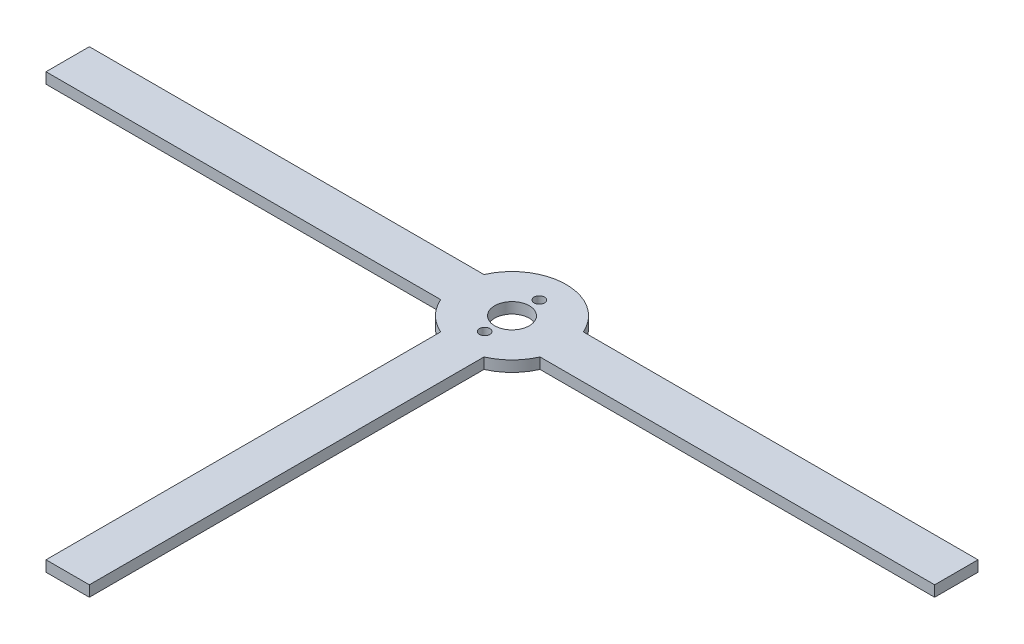
ISO-10303-21;
HEADER;
FILE_DESCRIPTION(('STEP AP214'),'2;1');
FILE_NAME('part.step','',(''),(''),'','','');
FILE_SCHEMA(('AUTOMOTIVE_DESIGN { 1 0 10303 214 1 1 1 1 }'));
ENDSEC;
DATA;
#1=APPLICATION_CONTEXT('core data for automotive mechanical design processes');
#2=APPLICATION_PROTOCOL_DEFINITION('international standard','automotive_design',2000,#1);
#3=PRODUCT_CONTEXT('',#1,'mechanical');
#4=PRODUCT('Part','Part','',(#3));
#5=PRODUCT_RELATED_PRODUCT_CATEGORY('part','',(#4));
#6=PRODUCT_DEFINITION_FORMATION('','',#4);
#7=PRODUCT_DEFINITION_CONTEXT('part definition',#1,'design');
#8=PRODUCT_DEFINITION('design','',#6,#7);
#9=PRODUCT_DEFINITION_SHAPE('','',#8);
#10=(LENGTH_UNIT() NAMED_UNIT(*) SI_UNIT(.MILLI.,.METRE.));
#11=(NAMED_UNIT(*) PLANE_ANGLE_UNIT() SI_UNIT($,.RADIAN.));
#12=(NAMED_UNIT(*) SI_UNIT($,.STERADIAN.) SOLID_ANGLE_UNIT());
#13=UNCERTAINTY_MEASURE_WITH_UNIT(LENGTH_MEASURE(1.E-05),#10,'distance_accuracy_value','');
#14=(GEOMETRIC_REPRESENTATION_CONTEXT(3) GLOBAL_UNCERTAINTY_ASSIGNED_CONTEXT((#13)) GLOBAL_UNIT_ASSIGNED_CONTEXT((#10,
#11,#12)) REPRESENTATION_CONTEXT('',''));
#15=CARTESIAN_POINT('',(0.,0.,0.));
#16=DIRECTION('',(0.,0.,1.));
#17=DIRECTION('',(1.,0.,0.));
#18=AXIS2_PLACEMENT_3D('',#15,#16,#17);
#19=CARTESIAN_POINT('',(-130.175,3.175,6.35000000000002));
#20=DIRECTION('',(1.,0.,0.));
#21=DIRECTION('',(0.,0.,-1.));
#22=AXIS2_PLACEMENT_3D('',#19,#20,#21);
#23=PLANE('',#22);
#24=DIRECTION('',(0.,0.,1.));
#25=VECTOR('',#24,1.);
#26=CARTESIAN_POINT('',(-130.175,0.,6.35000000000002));
#27=LINE('',#26,#25);
#28=CARTESIAN_POINT('',(-130.175,0.,-6.34999999999998));
#29=VERTEX_POINT('',#28);
#30=CARTESIAN_POINT('',(-130.175,0.,6.35000000000002));
#31=VERTEX_POINT('',#30);
#32=EDGE_CURVE('E153',#29,#31,#27,.T.);
#33=ORIENTED_EDGE('',*,*,#32,.T.);
#34=DIRECTION('',(0.,-1.,0.));
#35=VECTOR('',#34,1.);
#36=CARTESIAN_POINT('',(-130.175,3.175,6.35000000000002));
#37=LINE('',#36,#35);
#38=CARTESIAN_POINT('',(-130.175,3.175,6.35000000000002));
#39=VERTEX_POINT('',#38);
#40=EDGE_CURVE('E11',#39,#31,#37,.T.);
#41=ORIENTED_EDGE('',*,*,#40,.F.);
#42=DIRECTION('',(0.,0.,1.));
#43=VECTOR('',#42,1.);
#44=CARTESIAN_POINT('',(-130.175,3.175,6.35000000000002));
#45=LINE('',#44,#43);
#46=CARTESIAN_POINT('',(-130.175,3.175,-6.34999999999998));
#47=VERTEX_POINT('',#46);
#48=EDGE_CURVE('E176',#47,#39,#45,.T.);
#49=ORIENTED_EDGE('',*,*,#48,.F.);
#50=DIRECTION('',(0.,-1.,0.));
#51=VECTOR('',#50,1.);
#52=CARTESIAN_POINT('',(-130.175,3.175,-6.34999999999998));
#53=LINE('',#52,#51);
#54=EDGE_CURVE('E149',#47,#29,#53,.T.);
#55=ORIENTED_EDGE('',*,*,#54,.T.);
#56=EDGE_LOOP('',(#33,#41,#49,#55));
#57=FACE_BOUND('',#56,.T.);
#58=ADVANCED_FACE('F33',(#57),#23,.F.);
#59=CARTESIAN_POINT('',(-14.5496778314848,3.175,6.35));
#60=DIRECTION('',(0.,0.,-1.));
#61=DIRECTION('',(-1.,0.,0.));
#62=AXIS2_PLACEMENT_3D('',#59,#60,#61);
#63=PLANE('',#62);
#64=DIRECTION('',(1.,0.,0.));
#65=VECTOR('',#64,1.);
#66=CARTESIAN_POINT('',(-14.5496778314848,0.,6.35));
#67=LINE('',#66,#65);
#68=CARTESIAN_POINT('',(-14.5496778314848,0.,6.35));
#69=VERTEX_POINT('',#68);
#70=EDGE_CURVE('E156',#31,#69,#67,.T.);
#71=ORIENTED_EDGE('',*,*,#70,.T.);
#72=DIRECTION('',(0.,-1.,0.));
#73=VECTOR('',#72,1.);
#74=CARTESIAN_POINT('',(-14.5496778314848,3.175,6.35));
#75=LINE('',#74,#73);
#76=CARTESIAN_POINT('',(-14.5496778314848,3.175,6.35));
#77=VERTEX_POINT('',#76);
#78=EDGE_CURVE('E41',#77,#69,#75,.T.);
#79=ORIENTED_EDGE('',*,*,#78,.F.);
#80=DIRECTION('',(1.,0.,0.));
#81=VECTOR('',#80,1.);
#82=CARTESIAN_POINT('',(-14.5496778314848,3.175,6.35));
#83=LINE('',#82,#81);
#84=EDGE_CURVE('E104',#39,#77,#83,.T.);
#85=ORIENTED_EDGE('',*,*,#84,.F.);
#86=ORIENTED_EDGE('',*,*,#40,.T.);
#87=EDGE_LOOP('',(#71,#79,#85,#86));
#88=FACE_BOUND('',#87,.T.);
#89=ADVANCED_FACE('F255',(#88),#63,.F.);
#90=CARTESIAN_POINT('',(0.,3.175,0.));
#91=DIRECTION('',(0.,-1.,0.));
#92=DIRECTION('',(0.,0.,-1.));
#93=AXIS2_PLACEMENT_3D('',#90,#91,#92);
#94=CYLINDRICAL_SURFACE('',#93,15.875);
#95=CARTESIAN_POINT('',(0.,0.,0.));
#96=DIRECTION('',(0.,1.,0.));
#97=DIRECTION('',(0.,0.,1.));
#98=AXIS2_PLACEMENT_3D('',#95,#96,#97);
#99=CIRCLE('',#98,15.875);
#100=CARTESIAN_POINT('',(-6.35,0.,14.5496778314848));
#101=VERTEX_POINT('',#100);
#102=EDGE_CURVE('E159',#69,#101,#99,.T.);
#103=ORIENTED_EDGE('',*,*,#102,.T.);
#104=DIRECTION('',(0.,-1.,0.));
#105=VECTOR('',#104,1.);
#106=CARTESIAN_POINT('',(-6.35,3.175,14.5496778314848));
#107=LINE('',#106,#105);
#108=CARTESIAN_POINT('',(-6.35,3.175,14.5496778314848));
#109=VERTEX_POINT('',#108);
#110=EDGE_CURVE('E195',#109,#101,#107,.T.);
#111=ORIENTED_EDGE('',*,*,#110,.F.);
#112=CARTESIAN_POINT('',(0.,3.175,0.));
#113=DIRECTION('',(0.,1.,0.));
#114=DIRECTION('',(0.,0.,1.));
#115=AXIS2_PLACEMENT_3D('',#112,#113,#114);
#116=CIRCLE('',#115,15.875);
#117=EDGE_CURVE('E203',#77,#109,#116,.T.);
#118=ORIENTED_EDGE('',*,*,#117,.F.);
#119=ORIENTED_EDGE('',*,*,#78,.T.);
#120=EDGE_LOOP('',(#103,#111,#118,#119));
#121=FACE_BOUND('',#120,.T.);
#122=ADVANCED_FACE('F201',(#121),#94,.T.);
#123=CARTESIAN_POINT('',(-6.35,3.175,14.5496778314848));
#124=DIRECTION('',(1.,0.,0.));
#125=DIRECTION('',(0.,0.,-1.));
#126=AXIS2_PLACEMENT_3D('',#123,#124,#125);
#127=PLANE('',#126);
#128=DIRECTION('',(0.,0.,1.));
#129=VECTOR('',#128,1.);
#130=CARTESIAN_POINT('',(-6.35,0.,14.5496778314848));
#131=LINE('',#130,#129);
#132=CARTESIAN_POINT('',(-6.35,0.,130.175));
#133=VERTEX_POINT('',#132);
#134=EDGE_CURVE('E161',#101,#133,#131,.T.);
#135=ORIENTED_EDGE('',*,*,#134,.T.);
#136=DIRECTION('',(0.,-1.,0.));
#137=VECTOR('',#136,1.);
#138=CARTESIAN_POINT('',(-6.35,3.175,130.175));
#139=LINE('',#138,#137);
#140=CARTESIAN_POINT('',(-6.35,3.175,130.175));
#141=VERTEX_POINT('',#140);
#142=EDGE_CURVE('E192',#141,#133,#139,.T.);
#143=ORIENTED_EDGE('',*,*,#142,.F.);
#144=DIRECTION('',(0.,0.,1.));
#145=VECTOR('',#144,1.);
#146=CARTESIAN_POINT('',(-6.35,3.175,14.5496778314848));
#147=LINE('',#146,#145);
#148=EDGE_CURVE('E221',#109,#141,#147,.T.);
#149=ORIENTED_EDGE('',*,*,#148,.F.);
#150=ORIENTED_EDGE('',*,*,#110,.T.);
#151=EDGE_LOOP('',(#135,#143,#149,#150));
#152=FACE_BOUND('',#151,.T.);
#153=ADVANCED_FACE('F212',(#152),#127,.F.);
#154=CARTESIAN_POINT('',(-6.35,3.175,130.175));
#155=DIRECTION('',(0.,0.,-1.));
#156=DIRECTION('',(-1.,0.,0.));
#157=AXIS2_PLACEMENT_3D('',#154,#155,#156);
#158=PLANE('',#157);
#159=DIRECTION('',(1.,0.,0.));
#160=VECTOR('',#159,1.);
#161=CARTESIAN_POINT('',(-6.35,0.,130.175));
#162=LINE('',#161,#160);
#163=CARTESIAN_POINT('',(6.35,0.,130.175));
#164=VERTEX_POINT('',#163);
#165=EDGE_CURVE('E163',#133,#164,#162,.T.);
#166=ORIENTED_EDGE('',*,*,#165,.T.);
#167=DIRECTION('',(0.,-1.,0.));
#168=VECTOR('',#167,1.);
#169=CARTESIAN_POINT('',(6.35,3.175,130.175));
#170=LINE('',#169,#168);
#171=CARTESIAN_POINT('',(6.35,3.175,130.175));
#172=VERTEX_POINT('',#171);
#173=EDGE_CURVE('E189',#172,#164,#170,.T.);
#174=ORIENTED_EDGE('',*,*,#173,.F.);
#175=DIRECTION('',(1.,0.,0.));
#176=VECTOR('',#175,1.);
#177=CARTESIAN_POINT('',(-6.35,3.175,130.175));
#178=LINE('',#177,#176);
#179=EDGE_CURVE('E218',#141,#172,#178,.T.);
#180=ORIENTED_EDGE('',*,*,#179,.F.);
#181=ORIENTED_EDGE('',*,*,#142,.T.);
#182=EDGE_LOOP('',(#166,#174,#180,#181));
#183=FACE_BOUND('',#182,.T.);
#184=ADVANCED_FACE('F216',(#183),#158,.F.);
#185=CARTESIAN_POINT('',(6.35000000000002,3.175,14.5496778314848));
#186=DIRECTION('',(-1.,0.,0.));
#187=DIRECTION('',(0.,0.,1.));
#188=AXIS2_PLACEMENT_3D('',#185,#186,#187);
#189=PLANE('',#188);
#190=DIRECTION('',(0.,0.,-1.));
#191=VECTOR('',#190,1.);
#192=CARTESIAN_POINT('',(6.35000000000002,0.,14.5496778314848));
#193=LINE('',#192,#191);
#194=CARTESIAN_POINT('',(6.35000000000002,0.,14.5496778314848));
#195=VERTEX_POINT('',#194);
#196=EDGE_CURVE('E165',#164,#195,#193,.T.);
#197=ORIENTED_EDGE('',*,*,#196,.T.);
#198=DIRECTION('',(0.,-1.,0.));
#199=VECTOR('',#198,1.);
#200=CARTESIAN_POINT('',(6.35000000000002,3.175,14.5496778314848));
#201=LINE('',#200,#199);
#202=CARTESIAN_POINT('',(6.35000000000002,3.175,14.5496778314848));
#203=VERTEX_POINT('',#202);
#204=EDGE_CURVE('E186',#203,#195,#201,.T.);
#205=ORIENTED_EDGE('',*,*,#204,.F.);
#206=DIRECTION('',(0.,0.,-1.));
#207=VECTOR('',#206,1.);
#208=CARTESIAN_POINT('',(6.35000000000002,3.175,14.5496778314848));
#209=LINE('',#208,#207);
#210=EDGE_CURVE('E220',#172,#203,#209,.T.);
#211=ORIENTED_EDGE('',*,*,#210,.F.);
#212=ORIENTED_EDGE('',*,*,#173,.T.);
#213=EDGE_LOOP('',(#197,#205,#211,#212));
#214=FACE_BOUND('',#213,.T.);
#215=ADVANCED_FACE('F268',(#214),#189,.F.);
#216=CARTESIAN_POINT('',(0.,3.175,0.));
#217=DIRECTION('',(0.,-1.,0.));
#218=DIRECTION('',(0.,0.,-1.));
#219=AXIS2_PLACEMENT_3D('',#216,#217,#218);
#220=CYLINDRICAL_SURFACE('',#219,15.875);
#221=CARTESIAN_POINT('',(0.,0.,0.));
#222=DIRECTION('',(0.,1.,0.));
#223=DIRECTION('',(0.,0.,1.));
#224=AXIS2_PLACEMENT_3D('',#221,#222,#223);
#225=CIRCLE('',#224,15.875);
#226=CARTESIAN_POINT('',(14.5496778314848,0.,6.35));
#227=VERTEX_POINT('',#226);
#228=EDGE_CURVE('E167',#195,#227,#225,.T.);
#229=ORIENTED_EDGE('',*,*,#228,.T.);
#230=DIRECTION('',(0.,-1.,0.));
#231=VECTOR('',#230,1.);
#232=CARTESIAN_POINT('',(14.5496778314848,3.175,6.35));
#233=LINE('',#232,#231);
#234=CARTESIAN_POINT('',(14.5496778314848,3.175,6.35));
#235=VERTEX_POINT('',#234);
#236=EDGE_CURVE('E183',#235,#227,#233,.T.);
#237=ORIENTED_EDGE('',*,*,#236,.F.);
#238=CARTESIAN_POINT('',(0.,3.175,0.));
#239=DIRECTION('',(0.,1.,0.));
#240=DIRECTION('',(0.,0.,1.));
#241=AXIS2_PLACEMENT_3D('',#238,#239,#240);
#242=CIRCLE('',#241,15.875);
#243=EDGE_CURVE('E223',#203,#235,#242,.T.);
#244=ORIENTED_EDGE('',*,*,#243,.F.);
#245=ORIENTED_EDGE('',*,*,#204,.T.);
#246=EDGE_LOOP('',(#229,#237,#244,#245));
#247=FACE_BOUND('',#246,.T.);
#248=ADVANCED_FACE('F271',(#247),#220,.T.);
#249=CARTESIAN_POINT('',(130.175,3.175,6.34999999999998));
#250=DIRECTION('',(0.,0.,-1.));
#251=DIRECTION('',(-1.,0.,0.));
#252=AXIS2_PLACEMENT_3D('',#249,#250,#251);
#253=PLANE('',#252);
#254=DIRECTION('',(1.,0.,0.));
#255=VECTOR('',#254,1.);
#256=CARTESIAN_POINT('',(130.175,0.,6.34999999999998));
#257=LINE('',#256,#255);
#258=CARTESIAN_POINT('',(130.175,0.,6.34999999999998));
#259=VERTEX_POINT('',#258);
#260=EDGE_CURVE('E169',#227,#259,#257,.T.);
#261=ORIENTED_EDGE('',*,*,#260,.T.);
#262=DIRECTION('',(0.,-1.,0.));
#263=VECTOR('',#262,1.);
#264=CARTESIAN_POINT('',(130.175,3.175,6.34999999999998));
#265=LINE('',#264,#263);
#266=CARTESIAN_POINT('',(130.175,3.175,6.34999999999998));
#267=VERTEX_POINT('',#266);
#268=EDGE_CURVE('E180',#267,#259,#265,.T.);
#269=ORIENTED_EDGE('',*,*,#268,.F.);
#270=DIRECTION('',(1.,0.,0.));
#271=VECTOR('',#270,1.);
#272=CARTESIAN_POINT('',(130.175,3.175,6.34999999999998));
#273=LINE('',#272,#271);
#274=EDGE_CURVE('E229',#235,#267,#273,.T.);
#275=ORIENTED_EDGE('',*,*,#274,.F.);
#276=ORIENTED_EDGE('',*,*,#236,.T.);
#277=EDGE_LOOP('',(#261,#269,#275,#276));
#278=FACE_BOUND('',#277,.T.);
#279=ADVANCED_FACE('F235',(#278),#253,.F.);
#280=CARTESIAN_POINT('',(130.175,3.175,6.34999999999998));
#281=DIRECTION('',(-1.,0.,0.));
#282=DIRECTION('',(0.,0.,1.));
#283=AXIS2_PLACEMENT_3D('',#280,#281,#282);
#284=PLANE('',#283);
#285=DIRECTION('',(0.,0.,-1.));
#286=VECTOR('',#285,1.);
#287=CARTESIAN_POINT('',(130.175,0.,6.34999999999998));
#288=LINE('',#287,#286);
#289=CARTESIAN_POINT('',(130.175,0.,-6.35000000000002));
#290=VERTEX_POINT('',#289);
#291=EDGE_CURVE('E171',#259,#290,#288,.T.);
#292=ORIENTED_EDGE('',*,*,#291,.T.);
#293=DIRECTION('',(0.,-1.,0.));
#294=VECTOR('',#293,1.);
#295=CARTESIAN_POINT('',(130.175,3.175,-6.35000000000002));
#296=LINE('',#295,#294);
#297=CARTESIAN_POINT('',(130.175,3.175,-6.35000000000002));
#298=VERTEX_POINT('',#297);
#299=EDGE_CURVE('E144',#298,#290,#296,.T.);
#300=ORIENTED_EDGE('',*,*,#299,.F.);
#301=DIRECTION('',(0.,0.,-1.));
#302=VECTOR('',#301,1.);
#303=CARTESIAN_POINT('',(130.175,3.175,6.34999999999998));
#304=LINE('',#303,#302);
#305=EDGE_CURVE('E135',#267,#298,#304,.T.);
#306=ORIENTED_EDGE('',*,*,#305,.F.);
#307=ORIENTED_EDGE('',*,*,#268,.T.);
#308=EDGE_LOOP('',(#292,#300,#306,#307));
#309=FACE_BOUND('',#308,.T.);
#310=ADVANCED_FACE('F239',(#309),#284,.F.);
#311=CARTESIAN_POINT('',(130.175,3.175,-6.35000000000002));
#312=DIRECTION('',(0.,0.,1.));
#313=DIRECTION('',(1.,0.,0.));
#314=AXIS2_PLACEMENT_3D('',#311,#312,#313);
#315=PLANE('',#314);
#316=DIRECTION('',(-1.,0.,0.));
#317=VECTOR('',#316,1.);
#318=CARTESIAN_POINT('',(130.175,0.,-6.35000000000002));
#319=LINE('',#318,#317);
#320=CARTESIAN_POINT('',(14.5496778314848,0.,-6.35));
#321=VERTEX_POINT('',#320);
#322=EDGE_CURVE('E143',#290,#321,#319,.T.);
#323=ORIENTED_EDGE('',*,*,#322,.T.);
#324=DIRECTION('',(0.,-1.,0.));
#325=VECTOR('',#324,1.);
#326=CARTESIAN_POINT('',(14.5496778314848,3.175,-6.35));
#327=LINE('',#326,#325);
#328=CARTESIAN_POINT('',(14.5496778314848,3.175,-6.35));
#329=VERTEX_POINT('',#328);
#330=EDGE_CURVE('E140',#329,#321,#327,.T.);
#331=ORIENTED_EDGE('',*,*,#330,.F.);
#332=DIRECTION('',(-1.,0.,0.));
#333=VECTOR('',#332,1.);
#334=CARTESIAN_POINT('',(130.175,3.175,-6.35000000000002));
#335=LINE('',#334,#333);
#336=EDGE_CURVE('E129',#298,#329,#335,.T.);
#337=ORIENTED_EDGE('',*,*,#336,.F.);
#338=ORIENTED_EDGE('',*,*,#299,.T.);
#339=EDGE_LOOP('',(#323,#331,#337,#338));
#340=FACE_BOUND('',#339,.T.);
#341=ADVANCED_FACE('F141',(#340),#315,.F.);
#342=CARTESIAN_POINT('',(0.,3.175,0.));
#343=DIRECTION('',(0.,-1.,0.));
#344=DIRECTION('',(0.,0.,-1.));
#345=AXIS2_PLACEMENT_3D('',#342,#343,#344);
#346=CYLINDRICAL_SURFACE('',#345,15.875);
#347=CARTESIAN_POINT('',(0.,0.,0.));
#348=DIRECTION('',(0.,1.,0.));
#349=DIRECTION('',(0.,0.,1.));
#350=AXIS2_PLACEMENT_3D('',#347,#348,#349);
#351=CIRCLE('',#350,15.875);
#352=CARTESIAN_POINT('',(-14.5496778314848,0.,-6.35));
#353=VERTEX_POINT('',#352);
#354=EDGE_CURVE('E90',#321,#353,#351,.T.);
#355=ORIENTED_EDGE('',*,*,#354,.T.);
#356=DIRECTION('',(0.,-1.,0.));
#357=VECTOR('',#356,1.);
#358=CARTESIAN_POINT('',(-14.5496778314848,3.175,-6.35));
#359=LINE('',#358,#357);
#360=CARTESIAN_POINT('',(-14.5496778314848,3.175,-6.35));
#361=VERTEX_POINT('',#360);
#362=EDGE_CURVE('E145',#361,#353,#359,.T.);
#363=ORIENTED_EDGE('',*,*,#362,.F.);
#364=CARTESIAN_POINT('',(0.,3.175,0.));
#365=DIRECTION('',(0.,1.,0.));
#366=DIRECTION('',(0.,0.,1.));
#367=AXIS2_PLACEMENT_3D('',#364,#365,#366);
#368=CIRCLE('',#367,15.875);
#369=EDGE_CURVE('E133',#329,#361,#368,.T.);
#370=ORIENTED_EDGE('',*,*,#369,.F.);
#371=ORIENTED_EDGE('',*,*,#330,.T.);
#372=EDGE_LOOP('',(#355,#363,#370,#371));
#373=FACE_BOUND('',#372,.T.);
#374=ADVANCED_FACE('F147',(#373),#346,.T.);
#375=CARTESIAN_POINT('',(-14.5496778314848,3.175,-6.35));
#376=DIRECTION('',(0.,0.,1.));
#377=DIRECTION('',(1.,0.,0.));
#378=AXIS2_PLACEMENT_3D('',#375,#376,#377);
#379=PLANE('',#378);
#380=DIRECTION('',(-1.,0.,0.));
#381=VECTOR('',#380,1.);
#382=CARTESIAN_POINT('',(-14.5496778314848,0.,-6.35));
#383=LINE('',#382,#381);
#384=EDGE_CURVE('E96',#353,#29,#383,.T.);
#385=ORIENTED_EDGE('',*,*,#384,.T.);
#386=ORIENTED_EDGE('',*,*,#54,.F.);
#387=DIRECTION('',(-1.,0.,0.));
#388=VECTOR('',#387,1.);
#389=CARTESIAN_POINT('',(-14.5496778314848,3.175,-6.35));
#390=LINE('',#389,#388);
#391=EDGE_CURVE('E49',#361,#47,#390,.T.);
#392=ORIENTED_EDGE('',*,*,#391,.F.);
#393=ORIENTED_EDGE('',*,*,#362,.T.);
#394=EDGE_LOOP('',(#385,#386,#392,#393));
#395=FACE_BOUND('',#394,.T.);
#396=ADVANCED_FACE('F243',(#395),#379,.F.);
#397=CARTESIAN_POINT('',(0.,3.175,0.));
#398=DIRECTION('',(0.,1.,0.));
#399=DIRECTION('',(0.,0.,1.));
#400=AXIS2_PLACEMENT_3D('',#397,#398,#399);
#401=PLANE('',#400);
#402=CARTESIAN_POINT('',(0.,3.175,-8.));
#403=DIRECTION('',(0.,1.,0.));
#404=DIRECTION('',(0.,0.,1.));
#405=AXIS2_PLACEMENT_3D('',#402,#403,#404);
#406=CIRCLE('',#405,1.51329685617189);
#407=CARTESIAN_POINT('',(0.,3.175,-6.48670314382811));
#408=VERTEX_POINT('',#407);
#409=EDGE_CURVE('E157',#408,#408,#406,.T.);
#410=ORIENTED_EDGE('',*,*,#409,.F.);
#411=EDGE_LOOP('',(#410));
#412=FACE_BOUND('',#411,.T.);
#413=CARTESIAN_POINT('',(0.,3.175,8.));
#414=DIRECTION('',(0.,1.,0.));
#415=DIRECTION('',(0.,0.,1.));
#416=AXIS2_PLACEMENT_3D('',#413,#414,#415);
#417=CIRCLE('',#416,1.51329685617189);
#418=CARTESIAN_POINT('',(0.,3.175,9.51329685617189));
#419=VERTEX_POINT('',#418);
#420=EDGE_CURVE('E347',#419,#419,#417,.T.);
#421=ORIENTED_EDGE('',*,*,#420,.F.);
#422=EDGE_LOOP('',(#421));
#423=FACE_BOUND('',#422,.T.);
#424=CARTESIAN_POINT('',(0.,3.175,0.));
#425=DIRECTION('',(0.,1.,0.));
#426=DIRECTION('',(0.,0.,1.));
#427=AXIS2_PLACEMENT_3D('',#424,#425,#426);
#428=CIRCLE('',#427,5.08);
#429=CARTESIAN_POINT('',(0.,3.175,5.08));
#430=VERTEX_POINT('',#429);
#431=EDGE_CURVE('E356',#430,#430,#428,.T.);
#432=ORIENTED_EDGE('',*,*,#431,.F.);
#433=EDGE_LOOP('',(#432));
#434=FACE_BOUND('',#433,.T.);
#435=ORIENTED_EDGE('',*,*,#48,.T.);
#436=ORIENTED_EDGE('',*,*,#84,.T.);
#437=ORIENTED_EDGE('',*,*,#117,.T.);
#438=ORIENTED_EDGE('',*,*,#148,.T.);
#439=ORIENTED_EDGE('',*,*,#179,.T.);
#440=ORIENTED_EDGE('',*,*,#210,.T.);
#441=ORIENTED_EDGE('',*,*,#243,.T.);
#442=ORIENTED_EDGE('',*,*,#274,.T.);
#443=ORIENTED_EDGE('',*,*,#305,.T.);
#444=ORIENTED_EDGE('',*,*,#336,.T.);
#445=ORIENTED_EDGE('',*,*,#369,.T.);
#446=ORIENTED_EDGE('',*,*,#391,.T.);
#447=EDGE_LOOP('',(#435,#436,#437,#438,#439,#440,#441,#442,#443,#444,#445,#446));
#448=FACE_BOUND('',#447,.T.);
#449=ADVANCED_FACE('F131',(#412,#423,#434,#448),#401,.T.);
#450=CARTESIAN_POINT('',(0.,0.,0.));
#451=DIRECTION('',(0.,1.,0.));
#452=DIRECTION('',(0.,0.,1.));
#453=AXIS2_PLACEMENT_3D('',#450,#451,#452);
#454=PLANE('',#453);
#455=CARTESIAN_POINT('',(0.,0.,-8.));
#456=DIRECTION('',(0.,1.,0.));
#457=DIRECTION('',(0.,0.,1.));
#458=AXIS2_PLACEMENT_3D('',#455,#456,#457);
#459=CIRCLE('',#458,1.51329685617189);
#460=CARTESIAN_POINT('',(0.,0.,-6.48670314382811));
#461=VERTEX_POINT('',#460);
#462=EDGE_CURVE('E346',#461,#461,#459,.T.);
#463=ORIENTED_EDGE('',*,*,#462,.T.);
#464=EDGE_LOOP('',(#463));
#465=FACE_BOUND('',#464,.T.);
#466=CARTESIAN_POINT('',(0.,0.,8.));
#467=DIRECTION('',(0.,1.,0.));
#468=DIRECTION('',(0.,0.,1.));
#469=AXIS2_PLACEMENT_3D('',#466,#467,#468);
#470=CIRCLE('',#469,1.51329685617189);
#471=CARTESIAN_POINT('',(0.,0.,9.51329685617189));
#472=VERTEX_POINT('',#471);
#473=EDGE_CURVE('E351',#472,#472,#470,.T.);
#474=ORIENTED_EDGE('',*,*,#473,.T.);
#475=EDGE_LOOP('',(#474));
#476=FACE_BOUND('',#475,.T.);
#477=CARTESIAN_POINT('',(0.,0.,0.));
#478=DIRECTION('',(0.,1.,0.));
#479=DIRECTION('',(0.,0.,1.));
#480=AXIS2_PLACEMENT_3D('',#477,#478,#479);
#481=CIRCLE('',#480,5.08);
#482=CARTESIAN_POINT('',(0.,0.,5.08));
#483=VERTEX_POINT('',#482);
#484=EDGE_CURVE('E359',#483,#483,#481,.T.);
#485=ORIENTED_EDGE('',*,*,#484,.T.);
#486=EDGE_LOOP('',(#485));
#487=FACE_BOUND('',#486,.T.);
#488=ORIENTED_EDGE('',*,*,#32,.F.);
#489=ORIENTED_EDGE('',*,*,#384,.F.);
#490=ORIENTED_EDGE('',*,*,#354,.F.);
#491=ORIENTED_EDGE('',*,*,#322,.F.);
#492=ORIENTED_EDGE('',*,*,#291,.F.);
#493=ORIENTED_EDGE('',*,*,#260,.F.);
#494=ORIENTED_EDGE('',*,*,#228,.F.);
#495=ORIENTED_EDGE('',*,*,#196,.F.);
#496=ORIENTED_EDGE('',*,*,#165,.F.);
#497=ORIENTED_EDGE('',*,*,#134,.F.);
#498=ORIENTED_EDGE('',*,*,#102,.F.);
#499=ORIENTED_EDGE('',*,*,#70,.F.);
#500=EDGE_LOOP('',(#488,#489,#490,#491,#492,#493,#494,#495,#496,#497,#498,#499));
#501=FACE_BOUND('',#500,.T.);
#502=ADVANCED_FACE('F207',(#465,#476,#487,#501),#454,.F.);
#503=CARTESIAN_POINT('',(0.,3.175,0.));
#504=DIRECTION('',(0.,-1.,0.));
#505=DIRECTION('',(0.,0.,-1.));
#506=AXIS2_PLACEMENT_3D('',#503,#504,#505);
#507=CYLINDRICAL_SURFACE('',#506,5.08);
#508=ORIENTED_EDGE('',*,*,#431,.T.);
#509=EDGE_LOOP('',(#508));
#510=FACE_BOUND('',#509,.T.);
#511=ORIENTED_EDGE('',*,*,#484,.F.);
#512=EDGE_LOOP('',(#511));
#513=FACE_BOUND('',#512,.T.);
#514=ADVANCED_FACE('F308',(#510,#513),#507,.F.);
#515=CARTESIAN_POINT('',(0.,3.175,8.));
#516=DIRECTION('',(0.,-1.,0.));
#517=DIRECTION('',(0.,0.,-1.));
#518=AXIS2_PLACEMENT_3D('',#515,#516,#517);
#519=CYLINDRICAL_SURFACE('',#518,1.51329685617189);
#520=ORIENTED_EDGE('',*,*,#420,.T.);
#521=EDGE_LOOP('',(#520));
#522=FACE_BOUND('',#521,.T.);
#523=ORIENTED_EDGE('',*,*,#473,.F.);
#524=EDGE_LOOP('',(#523));
#525=FACE_BOUND('',#524,.T.);
#526=ADVANCED_FACE('F317',(#522,#525),#519,.F.);
#527=CARTESIAN_POINT('',(0.,3.175,-8.));
#528=DIRECTION('',(0.,-1.,0.));
#529=DIRECTION('',(0.,0.,-1.));
#530=AXIS2_PLACEMENT_3D('',#527,#528,#529);
#531=CYLINDRICAL_SURFACE('',#530,1.51329685617189);
#532=ORIENTED_EDGE('',*,*,#409,.T.);
#533=EDGE_LOOP('',(#532));
#534=FACE_BOUND('',#533,.T.);
#535=ORIENTED_EDGE('',*,*,#462,.F.);
#536=EDGE_LOOP('',(#535));
#537=FACE_BOUND('',#536,.T.);
#538=ADVANCED_FACE('F327',(#534,#537),#531,.F.);
#539=CLOSED_SHELL('',(#58,#89,#122,#153,#184,#215,#248,#279,#310,#341,#374,#396,#449,#502,#514,
#526,#538));
#540=MANIFOLD_SOLID_BREP('B2',#539);
#541=ADVANCED_BREP_SHAPE_REPRESENTATION('',(#18,#540),#14);
#542=SHAPE_DEFINITION_REPRESENTATION(#9,#541);
ENDSEC;
END-ISO-10303-21;
